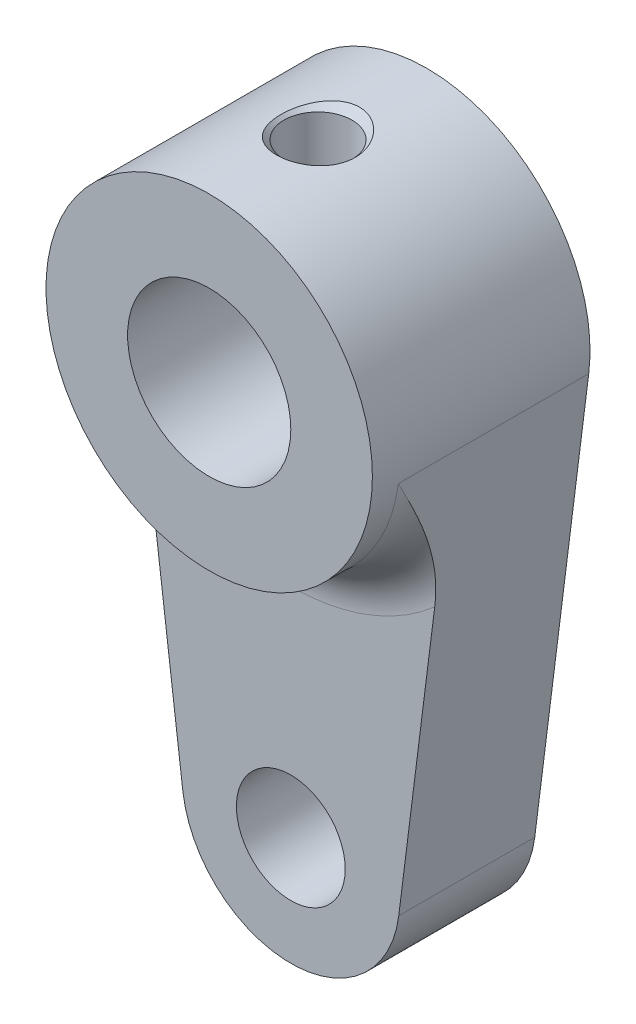
ISO-10303-21;
HEADER;
FILE_DESCRIPTION(('STEP AP214'),'2;1');
FILE_NAME('part.step','',(''),(''),'','','');
FILE_SCHEMA(('AUTOMOTIVE_DESIGN { 1 0 10303 214 1 1 1 1 }'));
ENDSEC;
DATA;
#1=APPLICATION_CONTEXT('core data for automotive mechanical design processes');
#2=APPLICATION_PROTOCOL_DEFINITION('international standard','automotive_design',2000,#1);
#3=PRODUCT_CONTEXT('',#1,'mechanical');
#4=PRODUCT('Part','Part','',(#3));
#5=PRODUCT_RELATED_PRODUCT_CATEGORY('part','',(#4));
#6=PRODUCT_DEFINITION_FORMATION('','',#4);
#7=PRODUCT_DEFINITION_CONTEXT('part definition',#1,'design');
#8=PRODUCT_DEFINITION('design','',#6,#7);
#9=PRODUCT_DEFINITION_SHAPE('','',#8);
#10=(LENGTH_UNIT() NAMED_UNIT(*) SI_UNIT(.MILLI.,.METRE.));
#11=(NAMED_UNIT(*) PLANE_ANGLE_UNIT() SI_UNIT($,.RADIAN.));
#12=(NAMED_UNIT(*) SI_UNIT($,.STERADIAN.) SOLID_ANGLE_UNIT());
#13=UNCERTAINTY_MEASURE_WITH_UNIT(LENGTH_MEASURE(1.E-05),#10,'distance_accuracy_value','');
#14=(GEOMETRIC_REPRESENTATION_CONTEXT(3) GLOBAL_UNCERTAINTY_ASSIGNED_CONTEXT((#13)) GLOBAL_UNIT_ASSIGNED_CONTEXT((#10,
#11,#12)) REPRESENTATION_CONTEXT('',''));
#15=CARTESIAN_POINT('',(0.,0.,0.));
#16=DIRECTION('',(0.,0.,1.));
#17=DIRECTION('',(1.,0.,0.));
#18=AXIS2_PLACEMENT_3D('',#15,#16,#17);
#19=CARTESIAN_POINT('',(0.,0.,2.5));
#20=DIRECTION('',(0.,0.,1.));
#21=DIRECTION('',(1.,0.,0.));
#22=AXIS2_PLACEMENT_3D('',#19,#20,#21);
#23=PLANE('',#22);
#24=DIRECTION('',(0.125,0.992156741649221,0.));
#25=VECTOR('',#24,1.);
#26=CARTESIAN_POINT('',(5.95294044989533,-0.75,2.5));
#27=LINE('',#26,#25);
#28=CARTESIAN_POINT('',(3.96862696659689,-16.5,2.5));
#29=VERTEX_POINT('',#28);
#30=CARTESIAN_POINT('',(5.29150262212918,-6.,2.5));
#31=VERTEX_POINT('',#30);
#32=EDGE_CURVE('E123',#29,#31,#27,.T.);
#33=ORIENTED_EDGE('',*,*,#32,.T.);
#34=CARTESIAN_POINT('',(0.,0.,2.5));
#35=DIRECTION('',(0.,0.,1.));
#36=DIRECTION('',(1.,0.,0.));
#37=AXIS2_PLACEMENT_3D('',#34,#35,#36);
#38=CIRCLE('',#37,8.);
#39=CARTESIAN_POINT('',(-5.29150262212918,-6.,2.5));
#40=VERTEX_POINT('',#39);
#41=EDGE_CURVE('E74',#31,#40,#38,.F.);
#42=ORIENTED_EDGE('',*,*,#41,.T.);
#43=DIRECTION('',(0.125,-0.992156741649221,0.));
#44=VECTOR('',#43,1.);
#45=CARTESIAN_POINT('',(-5.95294044989533,-0.75,2.5));
#46=LINE('',#45,#44);
#47=CARTESIAN_POINT('',(-3.96862696659689,-16.5,2.5));
#48=VERTEX_POINT('',#47);
#49=EDGE_CURVE('E97',#40,#48,#46,.T.);
#50=ORIENTED_EDGE('',*,*,#49,.T.);
#51=CARTESIAN_POINT('',(0.,-16.,2.5));
#52=DIRECTION('',(0.,0.,1.));
#53=DIRECTION('',(1.,0.,0.));
#54=AXIS2_PLACEMENT_3D('',#51,#52,#53);
#55=CIRCLE('',#54,4.);
#56=EDGE_CURVE('E101',#48,#29,#55,.T.);
#57=ORIENTED_EDGE('',*,*,#56,.T.);
#58=EDGE_LOOP('',(#33,#42,#50,#57));
#59=FACE_BOUND('',#58,.T.);
#60=CARTESIAN_POINT('',(0.,-16.,2.5));
#61=DIRECTION('',(0.,0.,1.));
#62=DIRECTION('',(1.,0.,0.));
#63=AXIS2_PLACEMENT_3D('',#60,#61,#62);
#64=CIRCLE('',#63,2.);
#65=CARTESIAN_POINT('',(2.,-16.,2.5));
#66=VERTEX_POINT('',#65);
#67=EDGE_CURVE('E134',#66,#66,#64,.T.);
#68=ORIENTED_EDGE('',*,*,#67,.F.);
#69=EDGE_LOOP('',(#68));
#70=FACE_BOUND('',#69,.T.);
#71=ADVANCED_FACE('F44',(#59,#70),#23,.T.);
#72=CARTESIAN_POINT('',(0.,0.,-2.5));
#73=DIRECTION('',(0.,0.,1.));
#74=DIRECTION('',(1.,0.,0.));
#75=AXIS2_PLACEMENT_3D('',#72,#73,#74);
#76=PLANE('',#75);
#77=CARTESIAN_POINT('',(0.,0.,-2.5));
#78=DIRECTION('',(0.,0.,1.));
#79=DIRECTION('',(1.,0.,0.));
#80=AXIS2_PLACEMENT_3D('',#77,#78,#79);
#81=CIRCLE('',#80,3.);
#82=CARTESIAN_POINT('',(3.,0.,-2.5));
#83=VERTEX_POINT('',#82);
#84=EDGE_CURVE('E215',#83,#83,#81,.T.);
#85=ORIENTED_EDGE('',*,*,#84,.T.);
#86=EDGE_LOOP('',(#85));
#87=FACE_BOUND('',#86,.T.);
#88=CARTESIAN_POINT('',(0.,0.,-2.5));
#89=DIRECTION('',(0.,0.,1.));
#90=DIRECTION('',(1.,0.,0.));
#91=AXIS2_PLACEMENT_3D('',#88,#89,#90);
#92=CIRCLE('',#91,6.);
#93=CARTESIAN_POINT('',(5.95294044989533,-0.75,-2.5));
#94=VERTEX_POINT('',#93);
#95=CARTESIAN_POINT('',(-5.95294044989533,-0.75,-2.5));
#96=VERTEX_POINT('',#95);
#97=EDGE_CURVE('E130',#94,#96,#92,.T.);
#98=ORIENTED_EDGE('',*,*,#97,.F.);
#99=DIRECTION('',(0.125,0.992156741649221,0.));
#100=VECTOR('',#99,1.);
#101=CARTESIAN_POINT('',(5.95294044989533,-0.75,-2.5));
#102=LINE('',#101,#100);
#103=CARTESIAN_POINT('',(3.96862696659689,-16.5,-2.5));
#104=VERTEX_POINT('',#103);
#105=EDGE_CURVE('E107',#104,#94,#102,.T.);
#106=ORIENTED_EDGE('',*,*,#105,.F.);
#107=CARTESIAN_POINT('',(0.,-16.,-2.5));
#108=DIRECTION('',(0.,0.,1.));
#109=DIRECTION('',(1.,0.,0.));
#110=AXIS2_PLACEMENT_3D('',#107,#108,#109);
#111=CIRCLE('',#110,4.);
#112=CARTESIAN_POINT('',(-3.96862696659689,-16.5,-2.5));
#113=VERTEX_POINT('',#112);
#114=EDGE_CURVE('E137',#113,#104,#111,.T.);
#115=ORIENTED_EDGE('',*,*,#114,.F.);
#116=DIRECTION('',(0.125,-0.992156741649221,0.));
#117=VECTOR('',#116,1.);
#118=CARTESIAN_POINT('',(-5.95294044989533,-0.75,-2.5));
#119=LINE('',#118,#117);
#120=EDGE_CURVE('E113',#96,#113,#119,.T.);
#121=ORIENTED_EDGE('',*,*,#120,.F.);
#122=EDGE_LOOP('',(#98,#106,#115,#121));
#123=FACE_BOUND('',#122,.T.);
#124=CARTESIAN_POINT('',(0.,-16.,-2.5));
#125=DIRECTION('',(0.,0.,1.));
#126=DIRECTION('',(1.,0.,0.));
#127=AXIS2_PLACEMENT_3D('',#124,#125,#126);
#128=CIRCLE('',#127,2.);
#129=CARTESIAN_POINT('',(2.,-16.,-2.5));
#130=VERTEX_POINT('',#129);
#131=EDGE_CURVE('E221',#130,#130,#128,.T.);
#132=ORIENTED_EDGE('',*,*,#131,.T.);
#133=EDGE_LOOP('',(#132));
#134=FACE_BOUND('',#133,.T.);
#135=ADVANCED_FACE('F173',(#87,#123,#134),#76,.F.);
#136=CARTESIAN_POINT('',(0.,0.,2.5));
#137=DIRECTION('',(0.,0.,-1.));
#138=DIRECTION('',(-1.,0.,0.));
#139=AXIS2_PLACEMENT_3D('',#136,#137,#138);
#140=CYLINDRICAL_SURFACE('',#139,6.);
#141=CARTESIAN_POINT('',(-1.00732038769462,5.91483775658699,0.471195652814624));
#142=CARTESIAN_POINT('',(-0.962317191332827,5.92250143302276,0.41640441748345));
#143=CARTESIAN_POINT('',(-0.91340876658222,5.93030364918488,0.364850926335108));
#144=CARTESIAN_POINT('',(-0.808379865747808,5.94553080189819,0.269572792829876));
#145=CARTESIAN_POINT('',(-0.752258250623665,5.95295567860448,0.225849389543488));
#146=CARTESIAN_POINT('',(-0.625775906560459,5.9676601706952,0.14248422678448));
#147=CARTESIAN_POINT('',(-0.55451436354661,5.97478837095161,0.104164355427293));
#148=CARTESIAN_POINT('',(-0.405867471684195,5.98671934201503,0.0415677094447143));
#149=CARTESIAN_POINT('',(-0.328485280620264,5.99152330296312,0.0172837464032125));
#150=CARTESIAN_POINT('',(-0.179022980119066,5.99774309929265,-0.0138906179040566));
#151=CARTESIAN_POINT('',(-0.107291191193517,5.99947254754072,-0.0223955486105924));
#152=CARTESIAN_POINT('',(0.0365433461046145,6.00031889859756,-0.0265751978302238));
#153=CARTESIAN_POINT('',(0.108645900791928,5.99943704967178,-0.0222560465730986));
#154=CARTESIAN_POINT('',(0.246267331412413,5.9953141428284,-0.00174251937128841));
#155=CARTESIAN_POINT('',(0.311910511379802,5.99222926587409,0.013666210099909));
#156=CARTESIAN_POINT('',(0.439773481718757,5.98420472660848,0.054734587135662));
#157=CARTESIAN_POINT('',(0.501992874501995,5.97926484940367,0.0803954223830217));
#158=CARTESIAN_POINT('',(0.623821573841098,5.96780788972078,0.142016976854412));
#159=CARTESIAN_POINT('',(0.683251734031648,5.96123965290115,0.178320615536919));
#160=CARTESIAN_POINT('',(0.795843853683669,5.94725631626724,0.259458737210815));
#161=CARTESIAN_POINT('',(0.849003479675828,5.93984090319929,0.304296379861368));
#162=CARTESIAN_POINT('',(0.953425641188962,5.92402343783294,0.406182857862323));
#163=CARTESIAN_POINT('',(1.00391896756611,5.91559884905014,0.464016008045253));
#164=CARTESIAN_POINT('',(1.09560247377608,5.89930740201001,0.58670270134418));
#165=CARTESIAN_POINT('',(1.13678839881263,5.89144079995428,0.651559435270558));
#166=CARTESIAN_POINT('',(1.2132693904529,5.87619471710081,0.79397445455404));
#167=CARTESIAN_POINT('',(1.24744994572647,5.86895929187496,0.872148202449915));
#168=CARTESIAN_POINT('',(1.3032860715337,5.8568134234958,1.0330185041214));
#169=CARTESIAN_POINT('',(1.3249378307076,5.85190368791816,1.11571642582151));
#170=CARTESIAN_POINT('',(1.35635884916718,5.84470479401133,1.28885581360794));
#171=CARTESIAN_POINT('',(1.36529527069335,5.8425998428805,1.3794572044747));
#172=CARTESIAN_POINT('',(1.36850379007078,5.84184891201591,1.56093835387692));
#173=CARTESIAN_POINT('',(1.36277377641036,5.84320343033836,1.65181815061283));
#174=CARTESIAN_POINT('',(1.33652139344613,5.84926447121163,1.83288599431699));
#175=CARTESIAN_POINT('',(1.31575025758393,5.85402734914448,1.92303628817305));
#176=CARTESIAN_POINT('',(1.25947827652883,5.86639064678413,2.09844003067314));
#177=CARTESIAN_POINT('',(1.22397530524898,5.87399147604598,2.18369277048343));
#178=CARTESIAN_POINT('',(1.13931658553147,5.89099266428588,2.34568233772349));
#179=CARTESIAN_POINT('',(1.09032465076898,5.90037103529284,2.42250677788116));
#180=CARTESIAN_POINT('',(0.979334263350411,5.91980290525049,2.56606316828005));
#181=CARTESIAN_POINT('',(0.917338709567701,5.92985625339069,2.63279736222531));
#182=CARTESIAN_POINT('',(0.785839093358985,5.94866235503463,2.74952029203001));
#183=CARTESIAN_POINT('',(0.717037204024138,5.95745709429637,2.8002897905426));
#184=CARTESIAN_POINT('',(0.570842030480344,5.97323304290606,2.88781006052077));
#185=CARTESIAN_POINT('',(0.493458376126532,5.98021625620802,2.92457634395417));
#186=CARTESIAN_POINT('',(0.342181655399001,5.99065652467354,2.97843546063922));
#187=CARTESIAN_POINT('',(0.268954589457822,5.99443248305544,2.99733812484182));
#188=CARTESIAN_POINT('',(0.120197675343217,5.99925587966176,3.02137010532803));
#189=CARTESIAN_POINT('',(0.0446695058064491,6.0003052608659,3.02650922969555));
#190=CARTESIAN_POINT('',(-0.098742405179903,5.99957496988739,3.02289997479175));
#191=CARTESIAN_POINT('',(-0.166663760494588,5.9980572860741,3.01543777906011));
#192=CARTESIAN_POINT('',(-0.300247551750527,5.99285568280296,2.98941587975734));
#193=CARTESIAN_POINT('',(-0.365910052701699,5.98917182574297,2.97085649584677));
#194=CARTESIAN_POINT('',(-0.493317050061244,5.98002734531731,2.92349877349868));
#195=CARTESIAN_POINT('',(-0.555059049712875,5.974565603009,2.89469398587934));
#196=CARTESIAN_POINT('',(-0.673283580356365,5.96240111334889,2.82801506021916));
#197=CARTESIAN_POINT('',(-0.729764596051768,5.95569801010474,2.7901383203765));
#198=CARTESIAN_POINT('',(-0.841132455502519,5.94103703297596,2.70296488817204));
#199=CARTESIAN_POINT('',(-0.895459311913314,5.93302078003899,2.65296399323564));
#200=CARTESIAN_POINT('',(-0.995950274759278,5.91698216428724,2.54535055604192));
#201=CARTESIAN_POINT('',(-1.04211063215647,5.90895980035553,2.48773453896517));
#202=CARTESIAN_POINT('',(-1.1304434363109,5.89273640259106,2.3594926727172));
#203=CARTESIAN_POINT('',(-1.17156643394769,5.88461868247892,2.28813244319221));
#204=CARTESIAN_POINT('',(-1.24241014142085,5.87007047103073,2.13980255015401));
#205=CARTESIAN_POINT('',(-1.27212661880629,5.86364060626174,2.06283081704356));
#206=CARTESIAN_POINT('',(-1.32171593410428,5.85267221327211,1.89868453830117));
#207=CARTESIAN_POINT('',(-1.3405815957416,5.84833204593825,1.81119095029019));
#208=CARTESIAN_POINT('',(-1.36419197372843,5.84286977192733,1.6342159933928));
#209=CARTESIAN_POINT('',(-1.36893379646575,5.84174832468514,1.54473422096101));
#210=CARTESIAN_POINT('',(-1.36414222217696,5.84286958283041,1.36340714638069));
#211=CARTESIAN_POINT('',(-1.35416496629163,5.84521689344821,1.27157386520607));
#212=CARTESIAN_POINT('',(-1.31928088071324,5.85318843834413,1.09091600073285));
#213=CARTESIAN_POINT('',(-1.29437288331993,5.85881292892227,1.0020916533304));
#214=CARTESIAN_POINT('',(-1.23208258805449,5.87221550271233,0.83550811092198));
#215=CARTESIAN_POINT('',(-1.19558555115352,5.87983549061587,0.75740435947028));
#216=CARTESIAN_POINT('',(-1.11039332822738,5.89651629692057,0.608360085281943));
#217=CARTESIAN_POINT('',(-1.0617088131171,5.90557585236716,0.537413371944137));
#218=CARTESIAN_POINT('',(-1.00732038769462,5.91483775658699,0.471195652814624));
#219=B_SPLINE_CURVE_WITH_KNOTS('',3,(#141,#142,#143,#144,#145,#146,#147,#148,#149,#150,#151,
#152,#153,#154,#155,#156,#157,#158,#159,#160,#161,#162,#163,#164,#165,#166,#167,#168,#169,#170,
#171,#172,#173,#174,#175,#176,#177,#178,#179,#180,#181,#182,#183,#184,#185,#186,#187,#188,#189,
#190,#191,#192,#193,#194,#195,#196,#197,#198,#199,#200,#201,#202,#203,#204,#205,#206,#207,#208,
#209,#210,#211,#212,#213,#214,#215,#216,#217,#218),.UNSPECIFIED.,.T.,.F.,(4,2,2,2,2,2,2,2,2,2,2,
2,2,2,2,2,2,2,2,2,2,2,2,2,2,2,2,2,2,2,2,2,2,2,2,2,2,2,4),(0.,0.213733155541426,
0.427500103408981,0.669774253726967,0.911924214426105,1.12753658726,1.34304590861945,
1.54462496549481,1.74622738161343,1.95521605804027,2.16428226220783,2.39504187409211,
2.62590676325621,2.88167235444698,3.1375157107233,3.40944750266352,3.68141844654745,
3.95799338049483,4.23460824341008,4.5080016842348,4.78133424260521,5.0377501507895,
5.29388118407225,5.51978182408475,5.7455214413709,5.94958401217285,6.15364070512411,
6.35782607377603,6.56207007229317,6.78397194471272,7.00597542394401,7.25320961412629,
7.5005354534127,7.76814510772492,8.03580958461878,8.31171231754418,8.58763663102752,
8.84616851973652,9.10447483418193),.UNSPECIFIED.);
#220=CARTESIAN_POINT('',(-1.00732038769462,5.91483775658699,0.471195652814624));
#221=VERTEX_POINT('',#220);
#222=EDGE_CURVE('E11',#221,#221,#219,.T.);
#223=ORIENTED_EDGE('',*,*,#222,.T.);
#224=EDGE_LOOP('',(#223));
#225=FACE_BOUND('',#224,.T.);
#226=CARTESIAN_POINT('',(0.,0.,4.5));
#227=DIRECTION('',(0.,0.,1.));
#228=DIRECTION('',(1.,0.,0.));
#229=AXIS2_PLACEMENT_3D('',#226,#227,#228);
#230=CIRCLE('',#229,6.);
#231=CARTESIAN_POINT('',(-5.95294044989533,-0.75,4.5));
#232=VERTEX_POINT('',#231);
#233=CARTESIAN_POINT('',(5.95294044989533,-0.75,4.5));
#234=VERTEX_POINT('',#233);
#235=EDGE_CURVE('E149',#232,#234,#230,.T.);
#236=ORIENTED_EDGE('',*,*,#235,.T.);
#237=DIRECTION('',(0.,0.,-1.));
#238=VECTOR('',#237,1.);
#239=CARTESIAN_POINT('',(5.95294044989533,-0.75,2.5));
#240=LINE('',#239,#238);
#241=EDGE_CURVE('E126',#234,#94,#240,.T.);
#242=ORIENTED_EDGE('',*,*,#241,.T.);
#243=ORIENTED_EDGE('',*,*,#97,.T.);
#244=DIRECTION('',(0.,0.,-1.));
#245=VECTOR('',#244,1.);
#246=CARTESIAN_POINT('',(-5.95294044989533,-0.75,2.5));
#247=LINE('',#246,#245);
#248=EDGE_CURVE('E117',#232,#96,#247,.T.);
#249=ORIENTED_EDGE('',*,*,#248,.F.);
#250=EDGE_LOOP('',(#236,#242,#243,#249));
#251=FACE_BOUND('',#250,.T.);
#252=CARTESIAN_POINT('',(0.,0.,5.5));
#253=DIRECTION('',(0.,0.,1.));
#254=DIRECTION('',(1.,0.,0.));
#255=AXIS2_PLACEMENT_3D('',#252,#253,#254);
#256=CIRCLE('',#255,6.);
#257=CARTESIAN_POINT('',(6.,0.,5.5));
#258=VERTEX_POINT('',#257);
#259=EDGE_CURVE('E224',#258,#258,#256,.T.);
#260=ORIENTED_EDGE('',*,*,#259,.F.);
#261=EDGE_LOOP('',(#260));
#262=FACE_BOUND('',#261,.T.);
#263=ADVANCED_FACE('F178',(#225,#251,#262),#140,.T.);
#264=CARTESIAN_POINT('',(-5.95294044989533,-0.75,2.5));
#265=DIRECTION('',(0.992156741649222,0.125,0.));
#266=DIRECTION('',(-0.125,0.992156741649222,0.));
#267=AXIS2_PLACEMENT_3D('',#264,#265,#266);
#268=PLANE('',#267);
#269=ORIENTED_EDGE('',*,*,#120,.T.);
#270=DIRECTION('',(0.,0.,-1.));
#271=VECTOR('',#270,1.);
#272=CARTESIAN_POINT('',(-3.96862696659689,-16.5,2.5));
#273=LINE('',#272,#271);
#274=EDGE_CURVE('E110',#48,#113,#273,.T.);
#275=ORIENTED_EDGE('',*,*,#274,.F.);
#276=ORIENTED_EDGE('',*,*,#49,.F.);
#277=CARTESIAN_POINT('',(-5.29150262212918,-6.,2.5));
#278=CARTESIAN_POINT('',(-5.31039781985096,-5.85002401756432,2.50003932371851));
#279=CARTESIAN_POINT('',(-5.32927068108442,-5.70022532550846,2.507490808616));
#280=CARTESIAN_POINT('',(-5.36682983971652,-5.4021087459284,2.53529748814426));
#281=CARTESIAN_POINT('',(-5.38551644968341,-5.25378837747063,2.55562506504848));
#282=CARTESIAN_POINT('',(-5.4223769561308,-4.96121717769153,2.60690972129832));
#283=CARTESIAN_POINT('',(-5.44055436264522,-4.81693848633967,2.63771036698708));
#284=CARTESIAN_POINT('',(-5.47663555915584,-4.53055286742147,2.70848018103587));
#285=CARTESIAN_POINT('',(-5.49453918362409,-4.38844725369238,2.74845467894672));
#286=CARTESIAN_POINT('',(-5.55104862359352,-3.93991747903246,2.88804779430897));
#287=CARTESIAN_POINT('',(-5.58909054596908,-3.63796908103082,3.0022836971651));
#288=CARTESIAN_POINT('',(-5.66384180156043,-3.04464938357723,3.25580816906869));
#289=CARTESIAN_POINT('',(-5.70054954085284,-2.75329073549991,3.39512559194422));
#290=CARTESIAN_POINT('',(-5.80963672037364,-1.88743809078733,3.8381210802768));
#291=CARTESIAN_POINT('',(-5.88048240155451,-1.32511792918458,4.16533067273523));
#292=CARTESIAN_POINT('',(-5.95182241893327,-0.758874095651091,4.49483605454544));
#293=CARTESIAN_POINT('',(-5.95238143594607,-0.754437035667476,4.49741804396528));
#294=CARTESIAN_POINT('',(-5.95294044989533,-0.750000000000002,4.5));
#295=B_SPLINE_CURVE_WITH_KNOTS('',3,(#277,#278,#279,#280,#281,#282,#283,#284,#285,#286,#287,
#288,#289,#290,#291,#292,#293,#294),.UNSPECIFIED.,.F.,.F.,(4,2,2,2,2,2,2,2,4),(0.,
0.453047985172782,0.905127510165753,1.35073120961546,1.79659444088086,2.76988627914198,
3.74430503334817,5.70583133706966,5.72132327058453),.UNSPECIFIED.);
#296=EDGE_CURVE('E60',#40,#232,#295,.T.);
#297=ORIENTED_EDGE('',*,*,#296,.T.);
#298=ORIENTED_EDGE('',*,*,#248,.T.);
#299=EDGE_LOOP('',(#269,#275,#276,#297,#298));
#300=FACE_BOUND('',#299,.T.);
#301=ADVANCED_FACE('F111',(#300),#268,.F.);
#302=CARTESIAN_POINT('',(0.,-16.,2.5));
#303=DIRECTION('',(0.,0.,-1.));
#304=DIRECTION('',(-1.,0.,0.));
#305=AXIS2_PLACEMENT_3D('',#302,#303,#304);
#306=CYLINDRICAL_SURFACE('',#305,4.);
#307=ORIENTED_EDGE('',*,*,#114,.T.);
#308=DIRECTION('',(0.,0.,-1.));
#309=VECTOR('',#308,1.);
#310=CARTESIAN_POINT('',(3.96862696659689,-16.5,2.5));
#311=LINE('',#310,#309);
#312=EDGE_CURVE('E118',#29,#104,#311,.T.);
#313=ORIENTED_EDGE('',*,*,#312,.F.);
#314=ORIENTED_EDGE('',*,*,#56,.F.);
#315=ORIENTED_EDGE('',*,*,#274,.T.);
#316=EDGE_LOOP('',(#307,#313,#314,#315));
#317=FACE_BOUND('',#316,.T.);
#318=ADVANCED_FACE('F120',(#317),#306,.T.);
#319=CARTESIAN_POINT('',(5.95294044989533,-0.75,2.5));
#320=DIRECTION('',(-0.992156741649222,0.125,0.));
#321=DIRECTION('',(-0.125,-0.992156741649222,0.));
#322=AXIS2_PLACEMENT_3D('',#319,#320,#321);
#323=PLANE('',#322);
#324=ORIENTED_EDGE('',*,*,#105,.T.);
#325=ORIENTED_EDGE('',*,*,#241,.F.);
#326=CARTESIAN_POINT('',(5.29150262212918,-6.,2.5));
#327=CARTESIAN_POINT('',(5.31039781985099,-5.85002401756414,2.50003932371851));
#328=CARTESIAN_POINT('',(5.32927068108446,-5.70022532550809,2.50749080861602));
#329=CARTESIAN_POINT('',(5.3668298397166,-5.40210874592769,2.53529748814434));
#330=CARTESIAN_POINT('',(5.38551644968351,-5.25378837746978,2.5556250650486));
#331=CARTESIAN_POINT('',(5.4223769561309,-4.96121717769072,2.60690972129849));
#332=CARTESIAN_POINT('',(5.4405543626453,-4.81693848633905,2.63771036698723));
#333=CARTESIAN_POINT('',(5.47663555915587,-4.53055286742117,2.70848018103595));
#334=CARTESIAN_POINT('',(5.49453918362411,-4.38844725369223,2.74845467894675));
#335=CARTESIAN_POINT('',(5.55104862359351,-3.93991747903253,2.88804779430899));
#336=CARTESIAN_POINT('',(5.58909054596905,-3.63796908103103,3.00228369716529));
#337=CARTESIAN_POINT('',(5.66384180156041,-3.04464938357736,3.25580816906835));
#338=CARTESIAN_POINT('',(5.70054954085285,-2.7532907354998,3.39512559194316));
#339=CARTESIAN_POINT('',(5.80963672037347,-1.88743809078864,3.83812108027839));
#340=CARTESIAN_POINT('',(5.88048240155377,-1.32511792919024,4.16533067274486));
#341=CARTESIAN_POINT('',(5.95182241893326,-0.758874095651123,4.49483605454562));
#342=CARTESIAN_POINT('',(5.95238143594607,-0.754437035667491,4.49741804396538));
#343=CARTESIAN_POINT('',(5.95294044989533,-0.75,4.5));
#344=B_SPLINE_CURVE_WITH_KNOTS('',3,(#326,#327,#328,#329,#330,#331,#332,#333,#334,#335,#336,
#337,#338,#339,#340,#341,#342,#343),.UNSPECIFIED.,.F.,.F.,(4,2,2,2,2,2,2,2,4),(0.,
0.453047985173347,0.905127510166761,1.35073120961592,1.79659444088085,2.76988627914185,
3.74430503334759,5.70583133706975,5.72132327058452),.UNSPECIFIED.);
#345=EDGE_CURVE('E67',#234,#31,#344,.F.);
#346=ORIENTED_EDGE('',*,*,#345,.T.);
#347=ORIENTED_EDGE('',*,*,#32,.F.);
#348=ORIENTED_EDGE('',*,*,#312,.T.);
#349=EDGE_LOOP('',(#324,#325,#346,#347,#348));
#350=FACE_BOUND('',#349,.T.);
#351=ADVANCED_FACE('F167',(#350),#323,.F.);
#352=CARTESIAN_POINT('',(0.,-16.,2.5));
#353=DIRECTION('',(0.,0.,-1.));
#354=DIRECTION('',(-1.,0.,0.));
#355=AXIS2_PLACEMENT_3D('',#352,#353,#354);
#356=CYLINDRICAL_SURFACE('',#355,2.);
#357=ORIENTED_EDGE('',*,*,#67,.T.);
#358=EDGE_LOOP('',(#357));
#359=FACE_BOUND('',#358,.T.);
#360=ORIENTED_EDGE('',*,*,#131,.F.);
#361=EDGE_LOOP('',(#360));
#362=FACE_BOUND('',#361,.T.);
#363=ADVANCED_FACE('F172',(#359,#362),#356,.F.);
#364=CARTESIAN_POINT('',(0.,0.,5.5));
#365=DIRECTION('',(0.,0.,1.));
#366=DIRECTION('',(1.,0.,0.));
#367=AXIS2_PLACEMENT_3D('',#364,#365,#366);
#368=PLANE('',#367);
#369=CARTESIAN_POINT('',(0.,0.,5.5));
#370=DIRECTION('',(0.,0.,1.));
#371=DIRECTION('',(1.,0.,0.));
#372=AXIS2_PLACEMENT_3D('',#369,#370,#371);
#373=CIRCLE('',#372,3.);
#374=CARTESIAN_POINT('',(3.,0.,5.5));
#375=VERTEX_POINT('',#374);
#376=EDGE_CURVE('E232',#375,#375,#373,.T.);
#377=ORIENTED_EDGE('',*,*,#376,.F.);
#378=EDGE_LOOP('',(#377));
#379=FACE_BOUND('',#378,.T.);
#380=ORIENTED_EDGE('',*,*,#259,.T.);
#381=EDGE_LOOP('',(#380));
#382=FACE_BOUND('',#381,.T.);
#383=ADVANCED_FACE('F198',(#379,#382),#368,.T.);
#384=CARTESIAN_POINT('',(0.,0.,-2.5));
#385=DIRECTION('',(0.,0.,1.));
#386=DIRECTION('',(1.,0.,0.));
#387=AXIS2_PLACEMENT_3D('',#384,#385,#386);
#388=CYLINDRICAL_SURFACE('',#387,3.);
#389=CARTESIAN_POINT('',(0.,3.,2.74999999999999));
#390=CARTESIAN_POINT('',(0.0669580526362665,2.99999458367273,2.7499927949087));
#391=CARTESIAN_POINT('',(0.13402139706384,2.9977323297471,2.74458804147186));
#392=CARTESIAN_POINT('',(0.266247371156346,2.98890153579552,2.72316093507982));
#393=CARTESIAN_POINT('',(0.331404576423563,2.98232175901028,2.70711087553575));
#394=CARTESIAN_POINT('',(0.457688733653086,2.96556289038127,2.6650889082194));
#395=CARTESIAN_POINT('',(0.518828524426267,2.95539599975004,2.63915061053185));
#396=CARTESIAN_POINT('',(0.6358297566798,2.93245286470664,2.57822717676743));
#397=CARTESIAN_POINT('',(0.691692790015937,2.91967741092849,2.54324478102913));
#398=CARTESIAN_POINT('',(0.799448403559509,2.89207828351869,2.46337101740911));
#399=CARTESIAN_POINT('',(0.851041267517766,2.87718753326093,2.41809869121024));
#400=CARTESIAN_POINT('',(0.946159821091259,2.84732714068514,2.31973566521743));
#401=CARTESIAN_POINT('',(0.989681263153082,2.83235746106809,2.26664087510549));
#402=CARTESIAN_POINT('',(1.06953737697065,2.80321021812995,2.1509732224351));
#403=CARTESIAN_POINT('',(1.10541308153925,2.78910786873385,2.08806255157345));
#404=CARTESIAN_POINT('',(1.16593940588865,2.76435572357005,1.95642674207907));
#405=CARTESIAN_POINT('',(1.1905958083629,2.75370415000824,1.88770462051555));
#406=CARTESIAN_POINT('',(1.22674598312158,2.73778555387705,1.74984630823208));
#407=CARTESIAN_POINT('',(1.23881657877605,2.73228387651787,1.68088951660784));
#408=CARTESIAN_POINT('',(1.25125209967796,2.72661326219504,1.54172670731343));
#409=CARTESIAN_POINT('',(1.25162348054397,2.7264413842526,1.47152139997426));
#410=CARTESIAN_POINT('',(1.24108450363673,2.73125119560853,1.33759993956506));
#411=CARTESIAN_POINT('',(1.231036811123,2.73583882723623,1.27379890343554));
#412=CARTESIAN_POINT('',(1.20139191015776,2.74898482773797,1.14888790899961));
#413=CARTESIAN_POINT('',(1.18179287287176,2.75754395703564,1.08777846850823));
#414=CARTESIAN_POINT('',(1.1332195872757,2.77786184772757,0.968442297008559));
#415=CARTESIAN_POINT('',(1.10405471539236,2.78968481949136,0.910304579086623));
#416=CARTESIAN_POINT('',(1.03731242580562,2.81518331141086,0.799522266119856));
#417=CARTESIAN_POINT('',(0.999731690519539,2.8288595612978,0.746879849386485));
#418=CARTESIAN_POINT('',(0.913495965543831,2.85792976877979,0.643900041267165));
#419=CARTESIAN_POINT('',(0.864173483207522,2.87337121404473,0.594133432614567));
#420=CARTESIAN_POINT('',(0.757729591051508,2.90325673112529,0.503386497040822));
#421=CARTESIAN_POINT('',(0.700606359448453,2.9177005687701,0.462408228307826));
#422=CARTESIAN_POINT('',(0.578447948693373,2.94438283556473,0.389564176383738));
#423=CARTESIAN_POINT('',(0.513260582447677,2.95656266543334,0.357930554849323));
#424=CARTESIAN_POINT('',(0.37785240252683,2.97689481414803,0.306278860396745));
#425=CARTESIAN_POINT('',(0.307634394795033,2.985049358458,0.286254368056189));
#426=CARTESIAN_POINT('',(0.168928113346227,2.99599641186385,0.259584007873369));
#427=CARTESIAN_POINT('',(0.100611285278639,2.99909541047125,0.252172142556256));
#428=CARTESIAN_POINT('',(-0.0363546554960892,3.00056050368745,0.248653776385912));
#429=CARTESIAN_POINT('',(-0.105003667152635,2.99892795711939,0.252544029748006));
#430=CARTESIAN_POINT('',(-0.237098242341434,2.9913121765694,0.270971084806073));
#431=CARTESIAN_POINT('',(-0.300632966639386,2.9855488728399,0.284969954097203));
#432=CARTESIAN_POINT('',(-0.424382748971089,2.97048606772414,0.32246819454079));
#433=CARTESIAN_POINT('',(-0.484597386518359,2.96118611959704,0.345968765950308));
#434=CARTESIAN_POINT('',(-0.602108999869135,2.93958270645166,0.402570975712123));
#435=CARTESIAN_POINT('',(-0.659257236855322,2.92719491469281,0.435948183146038));
#436=CARTESIAN_POINT('',(-0.767346216231427,2.9007380457909,0.5110533777917));
#437=CARTESIAN_POINT('',(-0.818284352601938,2.88666826768733,0.552784851529279));
#438=CARTESIAN_POINT('',(-0.91633343027426,2.85712087895438,0.646903233272412));
#439=CARTESIAN_POINT('',(-0.962910697979832,2.84161451591029,0.699838502986265));
#440=CARTESIAN_POINT('',(-1.0466698461055,2.81184336768005,0.813021275935396));
#441=CARTESIAN_POINT('',(-1.08384959285617,2.79757886493439,0.873270435171737));
#442=CARTESIAN_POINT('',(-1.14815960208699,2.77181386243988,1.00061417530258));
#443=CARTESIAN_POINT('',(-1.17513918237328,2.76035562555112,1.06779403551483));
#444=CARTESIAN_POINT('',(-1.21717413951572,2.74208355658957,1.20637059381011));
#445=CARTESIAN_POINT('',(-1.23223934863687,2.73526589555752,1.27776376248335));
#446=CARTESIAN_POINT('',(-1.249040803489,2.72763164537264,1.41681869919921));
#447=CARTESIAN_POINT('',(-1.25171380413129,2.72639350967163,1.48434466229262));
#448=CARTESIAN_POINT('',(-1.24615575523912,2.72893853011024,1.6188428611411));
#449=CARTESIAN_POINT('',(-1.23792637964721,2.73272091540307,1.68581518031369));
#450=CARTESIAN_POINT('',(-1.21158404780491,2.74449551302268,1.81409274746889));
#451=CARTESIAN_POINT('',(-1.19394903571466,2.75228354846481,1.87551667346339));
#452=CARTESIAN_POINT('',(-1.14976328202134,2.77103181199189,1.99454802135723));
#453=CARTESIAN_POINT('',(-1.12321003517251,2.78199293131694,2.05215436539878));
#454=CARTESIAN_POINT('',(-1.06010285935489,2.80666954560013,2.16569589594912));
#455=CARTESIAN_POINT('',(-1.02304360910483,2.8205110271368,2.22132233016829));
#456=CARTESIAN_POINT('',(-0.940684072630385,2.84903689053839,2.32586013936068));
#457=CARTESIAN_POINT('',(-0.895380928905614,2.86372156345875,2.37476917560057));
#458=CARTESIAN_POINT('',(-0.793902045778816,2.89356392850106,2.46814868168474));
#459=CARTESIAN_POINT('',(-0.737174739949023,2.90867817511792,2.51203643284065));
#460=CARTESIAN_POINT('',(-0.616600079253195,2.9366014362202,2.58969945354362));
#461=CARTESIAN_POINT('',(-0.552749497945741,2.94940939916741,2.62347011488955));
#462=CARTESIAN_POINT('',(-0.420732056717946,2.97109183362461,2.67920984543988));
#463=CARTESIAN_POINT('',(-0.352653990980632,2.98002782581964,2.70136476661729));
#464=CARTESIAN_POINT('',(-0.213410421846555,2.99321009768625,2.73370632907783));
#465=CARTESIAN_POINT('',(-0.142255316980955,2.99747105811967,2.74393044252988));
#466=CARTESIAN_POINT('',(-0.0472360819191817,2.99972287568934,2.74933316108644));
#467=CARTESIAN_POINT('',(-0.0236245946756563,3.00000191102536,2.75000254214922));
#468=CARTESIAN_POINT('',(0.,3.,2.74999999999999));
#469=B_SPLINE_CURVE_WITH_KNOTS('',3,(#389,#390,#391,#392,#393,#394,#395,#396,#397,#398,#399,
#400,#401,#402,#403,#404,#405,#406,#407,#408,#409,#410,#411,#412,#413,#414,#415,#416,#417,#418,
#419,#420,#421,#422,#423,#424,#425,#426,#427,#428,#429,#430,#431,#432,#433,#434,#435,#436,#437,
#438,#439,#440,#441,#442,#443,#444,#445,#446,#447,#448,#449,#450,#451,#452,#453,#454,#455,#456,
#457,#458,#459,#460,#461,#462,#463,#464,#465,#466,#467,#468),.UNSPECIFIED.,.T.,.F.,(4,2,2,2,2,2,
2,2,2,2,2,2,2,2,2,2,2,2,2,2,2,2,2,2,2,2,2,2,2,2,2,2,2,2,2,2,2,2,2,4),(0.,0.200806918883938,
0.402138540628695,0.602791851906299,0.803384436852971,1.01317936288807,1.22308438131465,
1.44331724539125,1.66343646730587,1.87295273137557,2.08235338249045,2.27570157202555,
2.46908679727211,2.66658713058713,2.86416545717205,3.07844141127895,3.29276749314586,
3.51204055060812,3.73119224218295,3.93648443393249,4.1417176749317,4.33676589735719,
4.53183876601783,4.73297135272159,4.93418805469494,5.14978488029292,5.36543061240339,
5.58414788359521,5.80268447074578,6.00439877559641,6.20608211297534,6.3983764996476,
6.5907249495061,6.79463893397438,6.99862373425941,7.21746535004886,7.43640649428579,
7.65172855819382,7.86637250469318,7.93722256499094),.UNSPECIFIED.);
#470=CARTESIAN_POINT('',(0.,3.,2.74999999999999));
#471=VERTEX_POINT('',#470);
#472=EDGE_CURVE('E49',#471,#471,#469,.T.);
#473=ORIENTED_EDGE('',*,*,#472,.T.);
#474=EDGE_LOOP('',(#473));
#475=FACE_BOUND('',#474,.T.);
#476=ORIENTED_EDGE('',*,*,#84,.F.);
#477=EDGE_LOOP('',(#476));
#478=FACE_BOUND('',#477,.T.);
#479=ORIENTED_EDGE('',*,*,#376,.T.);
#480=EDGE_LOOP('',(#479));
#481=FACE_BOUND('',#480,.T.);
#482=ADVANCED_FACE('F194',(#475,#478,#481),#388,.F.);
#483=CARTESIAN_POINT('',(0.,0.,4.5));
#484=DIRECTION('',(0.,0.,1.));
#485=DIRECTION('',(1.,0.,0.));
#486=AXIS2_PLACEMENT_3D('',#483,#484,#485);
#487=TOROIDAL_SURFACE('',#486,8.,2.);
#488=ORIENTED_EDGE('',*,*,#296,.F.);
#489=ORIENTED_EDGE('',*,*,#41,.F.);
#490=ORIENTED_EDGE('',*,*,#345,.F.);
#491=ORIENTED_EDGE('',*,*,#235,.F.);
#492=EDGE_LOOP('',(#488,#489,#490,#491));
#493=FACE_BOUND('',#492,.T.);
#494=ADVANCED_FACE('F46',(#493),#487,.F.);
#495=CARTESIAN_POINT('',(0.,6.,1.5));
#496=DIRECTION('',(0.,1.,0.));
#497=DIRECTION('',(0.,0.,1.));
#498=AXIS2_PLACEMENT_3D('',#495,#496,#497);
#499=CYLINDRICAL_SURFACE('',#498,1.24999999999999);
#500=CARTESIAN_POINT('',(0.,5.725,1.5));
#501=DIRECTION('',(0.,1.,0.));
#502=DIRECTION('',(0.,0.,1.));
#503=AXIS2_PLACEMENT_3D('',#500,#501,#502);
#504=CIRCLE('',#503,1.24999999999999);
#505=CARTESIAN_POINT('',(0.,5.725,2.74999999999999));
#506=VERTEX_POINT('',#505);
#507=EDGE_CURVE('E238',#506,#506,#504,.T.);
#508=ORIENTED_EDGE('',*,*,#507,.T.);
#509=EDGE_LOOP('',(#508));
#510=FACE_BOUND('',#509,.T.);
#511=ORIENTED_EDGE('',*,*,#472,.F.);
#512=EDGE_LOOP('',(#511));
#513=FACE_BOUND('',#512,.T.);
#514=ADVANCED_FACE('F189',(#510,#513),#499,.F.);
#515=CARTESIAN_POINT('',(0.,6.,1.5));
#516=DIRECTION('',(0.,1.,0.));
#517=DIRECTION('',(0.,0.,1.));
#518=AXIS2_PLACEMENT_3D('',#515,#516,#517);
#519=CONICAL_SURFACE('',#518,1.525,0.78539816339747);
#520=ORIENTED_EDGE('',*,*,#507,.F.);
#521=EDGE_LOOP('',(#520));
#522=FACE_BOUND('',#521,.T.);
#523=ORIENTED_EDGE('',*,*,#222,.F.);
#524=EDGE_LOOP('',(#523));
#525=FACE_BOUND('',#524,.T.);
#526=ADVANCED_FACE('F186',(#522,#525),#519,.F.);
#527=CLOSED_SHELL('',(#71,#135,#263,#301,#318,#351,#363,#383,#482,#494,#514,#526));
#528=MANIFOLD_SOLID_BREP('B2',#527);
#529=ADVANCED_BREP_SHAPE_REPRESENTATION('',(#18,#528),#14);
#530=SHAPE_DEFINITION_REPRESENTATION(#9,#529);
ENDSEC;
END-ISO-10303-21;
